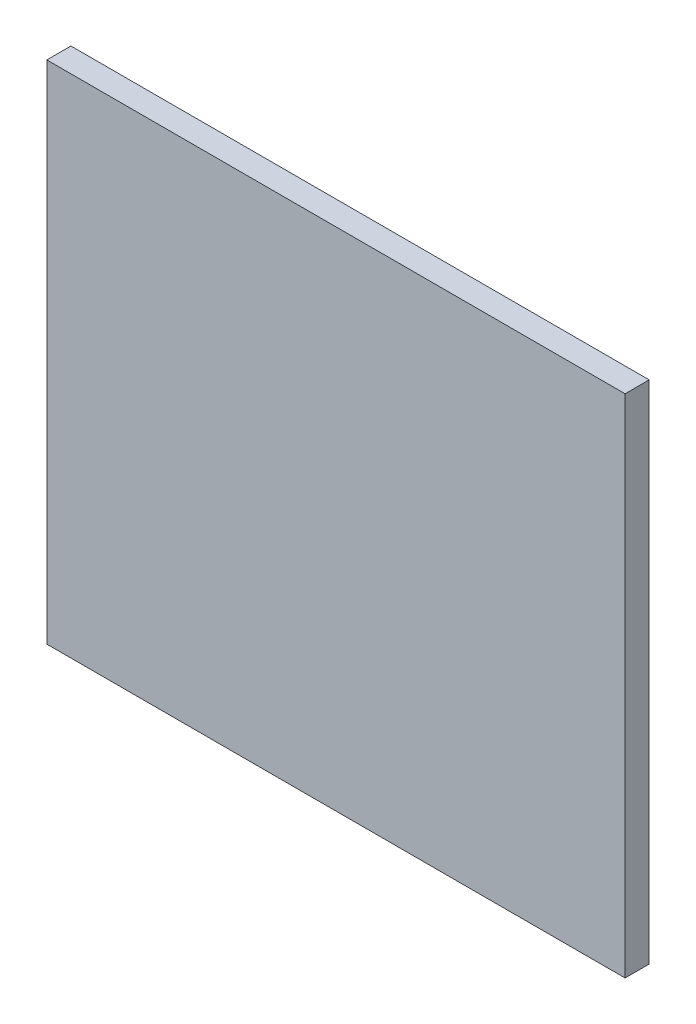
ISO-10303-21;
HEADER;
FILE_DESCRIPTION(('STEP AP214'),'2;1');
FILE_NAME('part.step','',(''),(''),'','','');
FILE_SCHEMA(('AUTOMOTIVE_DESIGN { 1 0 10303 214 1 1 1 1 }'));
ENDSEC;
DATA;
#1=APPLICATION_CONTEXT('core data for automotive mechanical design processes');
#2=APPLICATION_PROTOCOL_DEFINITION('international standard','automotive_design',2000,#1);
#3=PRODUCT_CONTEXT('',#1,'mechanical');
#4=PRODUCT('Part','Part','',(#3));
#5=PRODUCT_RELATED_PRODUCT_CATEGORY('part','',(#4));
#6=PRODUCT_DEFINITION_FORMATION('','',#4);
#7=PRODUCT_DEFINITION_CONTEXT('part definition',#1,'design');
#8=PRODUCT_DEFINITION('design','',#6,#7);
#9=PRODUCT_DEFINITION_SHAPE('','',#8);
#10=(LENGTH_UNIT() NAMED_UNIT(*) SI_UNIT(.MILLI.,.METRE.));
#11=(NAMED_UNIT(*) PLANE_ANGLE_UNIT() SI_UNIT($,.RADIAN.));
#12=(NAMED_UNIT(*) SI_UNIT($,.STERADIAN.) SOLID_ANGLE_UNIT());
#13=UNCERTAINTY_MEASURE_WITH_UNIT(LENGTH_MEASURE(1.E-05),#10,'distance_accuracy_value','');
#14=(GEOMETRIC_REPRESENTATION_CONTEXT(3) GLOBAL_UNCERTAINTY_ASSIGNED_CONTEXT((#13)) GLOBAL_UNIT_ASSIGNED_CONTEXT((#10,
#11,#12)) REPRESENTATION_CONTEXT('',''));
#15=CARTESIAN_POINT('',(0.,0.,0.));
#16=DIRECTION('',(0.,0.,1.));
#17=DIRECTION('',(1.,0.,0.));
#18=AXIS2_PLACEMENT_3D('',#15,#16,#17);
#19=CARTESIAN_POINT('',(240.,210.,10.));
#20=DIRECTION('',(0.,-1.,0.));
#21=DIRECTION('',(1.,0.,0.));
#22=AXIS2_PLACEMENT_3D('',#19,#20,#21);
#23=PLANE('',#22);
#24=DIRECTION('',(-1.,0.,0.));
#25=VECTOR('',#24,1.);
#26=CARTESIAN_POINT('',(240.,210.,0.));
#27=LINE('',#26,#25);
#28=CARTESIAN_POINT('',(240.,210.,0.));
#29=VERTEX_POINT('',#28);
#30=CARTESIAN_POINT('',(0.,210.,0.));
#31=VERTEX_POINT('',#30);
#32=EDGE_CURVE('E102',#29,#31,#27,.T.);
#33=ORIENTED_EDGE('',*,*,#32,.T.);
#34=DIRECTION('',(0.,0.,-1.));
#35=VECTOR('',#34,1.);
#36=CARTESIAN_POINT('',(0.,210.,10.));
#37=LINE('',#36,#35);
#38=CARTESIAN_POINT('',(0.,210.,10.));
#39=VERTEX_POINT('',#38);
#40=EDGE_CURVE('E11',#39,#31,#37,.T.);
#41=ORIENTED_EDGE('',*,*,#40,.F.);
#42=DIRECTION('',(-1.,0.,0.));
#43=VECTOR('',#42,1.);
#44=CARTESIAN_POINT('',(240.,210.,10.));
#45=LINE('',#44,#43);
#46=CARTESIAN_POINT('',(240.,210.,10.));
#47=VERTEX_POINT('',#46);
#48=EDGE_CURVE('E90',#47,#39,#45,.T.);
#49=ORIENTED_EDGE('',*,*,#48,.F.);
#50=DIRECTION('',(0.,0.,-1.));
#51=VECTOR('',#50,1.);
#52=CARTESIAN_POINT('',(240.,210.,10.));
#53=LINE('',#52,#51);
#54=EDGE_CURVE('E98',#47,#29,#53,.T.);
#55=ORIENTED_EDGE('',*,*,#54,.T.);
#56=EDGE_LOOP('',(#33,#41,#49,#55));
#57=FACE_BOUND('',#56,.T.);
#58=ADVANCED_FACE('F39',(#57),#23,.F.);
#59=CARTESIAN_POINT('',(0.,210.,10.));
#60=DIRECTION('',(1.,0.,0.));
#61=DIRECTION('',(0.,1.,0.));
#62=AXIS2_PLACEMENT_3D('',#59,#60,#61);
#63=PLANE('',#62);
#64=DIRECTION('',(0.,-1.,0.));
#65=VECTOR('',#64,1.);
#66=CARTESIAN_POINT('',(0.,210.,0.));
#67=LINE('',#66,#65);
#68=CARTESIAN_POINT('',(0.,0.,0.));
#69=VERTEX_POINT('',#68);
#70=EDGE_CURVE('E94',#31,#69,#67,.T.);
#71=ORIENTED_EDGE('',*,*,#70,.T.);
#72=DIRECTION('',(0.,0.,-1.));
#73=VECTOR('',#72,1.);
#74=CARTESIAN_POINT('',(0.,0.,10.));
#75=LINE('',#74,#73);
#76=CARTESIAN_POINT('',(0.,0.,10.));
#77=VERTEX_POINT('',#76);
#78=EDGE_CURVE('E47',#77,#69,#75,.T.);
#79=ORIENTED_EDGE('',*,*,#78,.F.);
#80=DIRECTION('',(0.,-1.,0.));
#81=VECTOR('',#80,1.);
#82=CARTESIAN_POINT('',(0.,210.,10.));
#83=LINE('',#82,#81);
#84=EDGE_CURVE('E85',#39,#77,#83,.T.);
#85=ORIENTED_EDGE('',*,*,#84,.F.);
#86=ORIENTED_EDGE('',*,*,#40,.T.);
#87=EDGE_LOOP('',(#71,#79,#85,#86));
#88=FACE_BOUND('',#87,.T.);
#89=ADVANCED_FACE('F93',(#88),#63,.F.);
#90=CARTESIAN_POINT('',(0.,0.,10.));
#91=DIRECTION('',(0.,1.,0.));
#92=DIRECTION('',(0.,0.,1.));
#93=AXIS2_PLACEMENT_3D('',#90,#91,#92);
#94=PLANE('',#93);
#95=DIRECTION('',(1.,0.,0.));
#96=VECTOR('',#95,1.);
#97=CARTESIAN_POINT('',(0.,0.,0.));
#98=LINE('',#97,#96);
#99=CARTESIAN_POINT('',(240.,0.,0.));
#100=VERTEX_POINT('',#99);
#101=EDGE_CURVE('E72',#69,#100,#98,.T.);
#102=ORIENTED_EDGE('',*,*,#101,.T.);
#103=DIRECTION('',(0.,0.,-1.));
#104=VECTOR('',#103,1.);
#105=CARTESIAN_POINT('',(240.,0.,10.));
#106=LINE('',#105,#104);
#107=CARTESIAN_POINT('',(240.,0.,10.));
#108=VERTEX_POINT('',#107);
#109=EDGE_CURVE('E95',#108,#100,#106,.T.);
#110=ORIENTED_EDGE('',*,*,#109,.F.);
#111=DIRECTION('',(1.,0.,0.));
#112=VECTOR('',#111,1.);
#113=CARTESIAN_POINT('',(0.,0.,10.));
#114=LINE('',#113,#112);
#115=EDGE_CURVE('E88',#77,#108,#114,.T.);
#116=ORIENTED_EDGE('',*,*,#115,.F.);
#117=ORIENTED_EDGE('',*,*,#78,.T.);
#118=EDGE_LOOP('',(#102,#110,#116,#117));
#119=FACE_BOUND('',#118,.T.);
#120=ADVANCED_FACE('F96',(#119),#94,.F.);
#121=CARTESIAN_POINT('',(240.,0.,10.));
#122=DIRECTION('',(-1.,0.,0.));
#123=DIRECTION('',(0.,0.,1.));
#124=AXIS2_PLACEMENT_3D('',#121,#122,#123);
#125=PLANE('',#124);
#126=DIRECTION('',(0.,1.,0.));
#127=VECTOR('',#126,1.);
#128=CARTESIAN_POINT('',(240.,0.,0.));
#129=LINE('',#128,#127);
#130=EDGE_CURVE('E78',#100,#29,#129,.T.);
#131=ORIENTED_EDGE('',*,*,#130,.T.);
#132=ORIENTED_EDGE('',*,*,#54,.F.);
#133=DIRECTION('',(0.,1.,0.));
#134=VECTOR('',#133,1.);
#135=CARTESIAN_POINT('',(240.,0.,10.));
#136=LINE('',#135,#134);
#137=EDGE_CURVE('E55',#108,#47,#136,.T.);
#138=ORIENTED_EDGE('',*,*,#137,.F.);
#139=ORIENTED_EDGE('',*,*,#109,.T.);
#140=EDGE_LOOP('',(#131,#132,#138,#139));
#141=FACE_BOUND('',#140,.T.);
#142=ADVANCED_FACE('F109',(#141),#125,.F.);
#143=CARTESIAN_POINT('',(0.,0.,10.));
#144=DIRECTION('',(0.,0.,1.));
#145=DIRECTION('',(1.,0.,0.));
#146=AXIS2_PLACEMENT_3D('',#143,#144,#145);
#147=PLANE('',#146);
#148=ORIENTED_EDGE('',*,*,#48,.T.);
#149=ORIENTED_EDGE('',*,*,#84,.T.);
#150=ORIENTED_EDGE('',*,*,#115,.T.);
#151=ORIENTED_EDGE('',*,*,#137,.T.);
#152=EDGE_LOOP('',(#148,#149,#150,#151));
#153=FACE_BOUND('',#152,.T.);
#154=ADVANCED_FACE('F86',(#153),#147,.T.);
#155=CARTESIAN_POINT('',(0.,0.,0.));
#156=DIRECTION('',(0.,0.,1.));
#157=DIRECTION('',(1.,0.,0.));
#158=AXIS2_PLACEMENT_3D('',#155,#156,#157);
#159=PLANE('',#158);
#160=ORIENTED_EDGE('',*,*,#32,.F.);
#161=ORIENTED_EDGE('',*,*,#130,.F.);
#162=ORIENTED_EDGE('',*,*,#101,.F.);
#163=ORIENTED_EDGE('',*,*,#70,.F.);
#164=EDGE_LOOP('',(#160,#161,#162,#163));
#165=FACE_BOUND('',#164,.T.);
#166=ADVANCED_FACE('F112',(#165),#159,.F.);
#167=CLOSED_SHELL('',(#58,#89,#120,#142,#154,#166));
#168=MANIFOLD_SOLID_BREP('B2',#167);
#169=ADVANCED_BREP_SHAPE_REPRESENTATION('',(#18,#168),#14);
#170=SHAPE_DEFINITION_REPRESENTATION(#9,#169);
ENDSEC;
END-ISO-10303-21;
